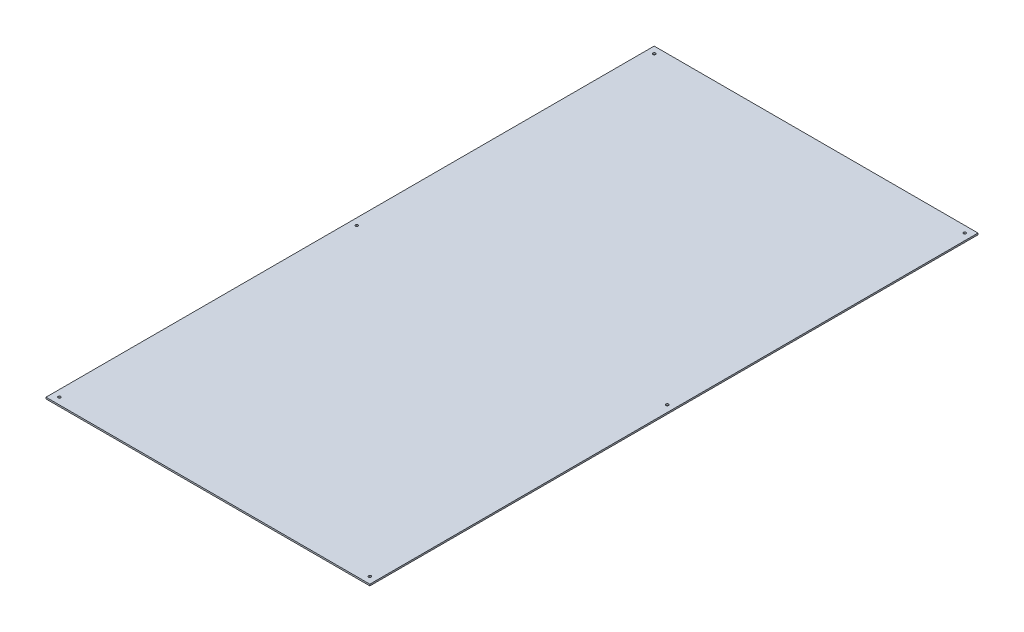
ISO-10303-21;
HEADER;
FILE_DESCRIPTION(('STEP AP214'),'2;1');
FILE_NAME('part.step','',(''),(''),'','','');
FILE_SCHEMA(('AUTOMOTIVE_DESIGN { 1 0 10303 214 1 1 1 1 }'));
ENDSEC;
DATA;
#1=APPLICATION_CONTEXT('core data for automotive mechanical design processes');
#2=APPLICATION_PROTOCOL_DEFINITION('international standard','automotive_design',2000,#1);
#3=PRODUCT_CONTEXT('',#1,'mechanical');
#4=PRODUCT('Part','Part','',(#3));
#5=PRODUCT_RELATED_PRODUCT_CATEGORY('part','',(#4));
#6=PRODUCT_DEFINITION_FORMATION('','',#4);
#7=PRODUCT_DEFINITION_CONTEXT('part definition',#1,'design');
#8=PRODUCT_DEFINITION('design','',#6,#7);
#9=PRODUCT_DEFINITION_SHAPE('','',#8);
#10=(LENGTH_UNIT() NAMED_UNIT(*) SI_UNIT(.MILLI.,.METRE.));
#11=(NAMED_UNIT(*) PLANE_ANGLE_UNIT() SI_UNIT($,.RADIAN.));
#12=(NAMED_UNIT(*) SI_UNIT($,.STERADIAN.) SOLID_ANGLE_UNIT());
#13=UNCERTAINTY_MEASURE_WITH_UNIT(LENGTH_MEASURE(1.E-05),#10,'distance_accuracy_value','');
#14=(GEOMETRIC_REPRESENTATION_CONTEXT(3) GLOBAL_UNCERTAINTY_ASSIGNED_CONTEXT((#13)) GLOBAL_UNIT_ASSIGNED_CONTEXT((#10,
#11,#12)) REPRESENTATION_CONTEXT('',''));
#15=CARTESIAN_POINT('',(0.,0.,0.));
#16=DIRECTION('',(0.,0.,1.));
#17=DIRECTION('',(1.,0.,0.));
#18=AXIS2_PLACEMENT_3D('',#15,#16,#17);
#19=CARTESIAN_POINT('',(0.,2.8,0.));
#20=DIRECTION('',(0.,-1.,0.));
#21=DIRECTION('',(0.,0.,-1.));
#22=AXIS2_PLACEMENT_3D('',#19,#20,#21);
#23=PLANE('',#22);
#24=DIRECTION('',(0.,0.,1.));
#25=VECTOR('',#24,1.);
#26=CARTESIAN_POINT('',(-291.,2.8,-546.5));
#27=LINE('',#26,#25);
#28=CARTESIAN_POINT('',(-291.,2.8,-546.5));
#29=VERTEX_POINT('',#28);
#30=CARTESIAN_POINT('',(-291.,2.8,546.5));
#31=VERTEX_POINT('',#30);
#32=EDGE_CURVE('E89',#29,#31,#27,.T.);
#33=ORIENTED_EDGE('',*,*,#32,.T.);
#34=DIRECTION('',(1.,0.,0.));
#35=VECTOR('',#34,1.);
#36=CARTESIAN_POINT('',(291.,2.8,546.5));
#37=LINE('',#36,#35);
#38=CARTESIAN_POINT('',(291.,2.8,546.5));
#39=VERTEX_POINT('',#38);
#40=EDGE_CURVE('E84',#31,#39,#37,.T.);
#41=ORIENTED_EDGE('',*,*,#40,.T.);
#42=DIRECTION('',(0.,0.,-1.));
#43=VECTOR('',#42,1.);
#44=CARTESIAN_POINT('',(291.,2.8,-546.5));
#45=LINE('',#44,#43);
#46=CARTESIAN_POINT('',(291.,2.8,-546.5));
#47=VERTEX_POINT('',#46);
#48=EDGE_CURVE('E87',#39,#47,#45,.T.);
#49=ORIENTED_EDGE('',*,*,#48,.T.);
#50=DIRECTION('',(-1.,0.,0.));
#51=VECTOR('',#50,1.);
#52=CARTESIAN_POINT('',(291.,2.8,-546.5));
#53=LINE('',#52,#51);
#54=EDGE_CURVE('E54',#47,#29,#53,.T.);
#55=ORIENTED_EDGE('',*,*,#54,.T.);
#56=EDGE_LOOP('',(#33,#41,#49,#55));
#57=FACE_BOUND('',#56,.T.);
#58=CARTESIAN_POINT('',(279.,2.8,-534.5));
#59=DIRECTION('',(0.,1.,0.));
#60=DIRECTION('',(0.,0.,1.));
#61=AXIS2_PLACEMENT_3D('',#58,#59,#60);
#62=CIRCLE('',#61,2.38125000000001);
#63=CARTESIAN_POINT('',(279.,2.8,-532.11875));
#64=VERTEX_POINT('',#63);
#65=EDGE_CURVE('E104',#64,#64,#62,.T.);
#66=ORIENTED_EDGE('',*,*,#65,.F.);
#67=EDGE_LOOP('',(#66));
#68=FACE_BOUND('',#67,.T.);
#69=CARTESIAN_POINT('',(-279.,2.8,-534.5));
#70=DIRECTION('',(0.,1.,0.));
#71=DIRECTION('',(0.,0.,1.));
#72=AXIS2_PLACEMENT_3D('',#69,#70,#71);
#73=CIRCLE('',#72,2.38125000000001);
#74=CARTESIAN_POINT('',(-279.,2.8,-532.11875));
#75=VERTEX_POINT('',#74);
#76=EDGE_CURVE('E119',#75,#75,#73,.T.);
#77=ORIENTED_EDGE('',*,*,#76,.F.);
#78=EDGE_LOOP('',(#77));
#79=FACE_BOUND('',#78,.T.);
#80=CARTESIAN_POINT('',(-279.,2.8,-2.22044604925031E-13));
#81=DIRECTION('',(0.,1.,0.));
#82=DIRECTION('',(0.,0.,1.));
#83=AXIS2_PLACEMENT_3D('',#80,#81,#82);
#84=CIRCLE('',#83,2.38125000000001);
#85=CARTESIAN_POINT('',(-279.,2.8,2.38124999999978));
#86=VERTEX_POINT('',#85);
#87=EDGE_CURVE('E125',#86,#86,#84,.T.);
#88=ORIENTED_EDGE('',*,*,#87,.F.);
#89=EDGE_LOOP('',(#88));
#90=FACE_BOUND('',#89,.T.);
#91=CARTESIAN_POINT('',(279.,2.8,-2.22044604925031E-13));
#92=DIRECTION('',(0.,1.,0.));
#93=DIRECTION('',(0.,0.,1.));
#94=AXIS2_PLACEMENT_3D('',#91,#92,#93);
#95=CIRCLE('',#94,2.38125000000001);
#96=CARTESIAN_POINT('',(279.,2.8,2.38124999999978));
#97=VERTEX_POINT('',#96);
#98=EDGE_CURVE('E131',#97,#97,#95,.T.);
#99=ORIENTED_EDGE('',*,*,#98,.F.);
#100=EDGE_LOOP('',(#99));
#101=FACE_BOUND('',#100,.T.);
#102=CARTESIAN_POINT('',(-279.,2.8,534.5));
#103=DIRECTION('',(0.,1.,0.));
#104=DIRECTION('',(0.,0.,1.));
#105=AXIS2_PLACEMENT_3D('',#102,#103,#104);
#106=CIRCLE('',#105,2.38125000000001);
#107=CARTESIAN_POINT('',(-279.,2.8,536.88125));
#108=VERTEX_POINT('',#107);
#109=EDGE_CURVE('E137',#108,#108,#106,.T.);
#110=ORIENTED_EDGE('',*,*,#109,.F.);
#111=EDGE_LOOP('',(#110));
#112=FACE_BOUND('',#111,.T.);
#113=CARTESIAN_POINT('',(279.,2.8,534.5));
#114=DIRECTION('',(0.,1.,0.));
#115=DIRECTION('',(0.,0.,1.));
#116=AXIS2_PLACEMENT_3D('',#113,#114,#115);
#117=CIRCLE('',#116,2.38125000000001);
#118=CARTESIAN_POINT('',(279.,2.8,536.88125));
#119=VERTEX_POINT('',#118);
#120=EDGE_CURVE('E143',#119,#119,#117,.T.);
#121=ORIENTED_EDGE('',*,*,#120,.F.);
#122=EDGE_LOOP('',(#121));
#123=FACE_BOUND('',#122,.T.);
#124=ADVANCED_FACE('F37',(#57,#68,#79,#90,#101,#112,#123),#23,.F.);
#125=CARTESIAN_POINT('',(0.,0.,0.));
#126=DIRECTION('',(0.,-1.,0.));
#127=DIRECTION('',(0.,0.,-1.));
#128=AXIS2_PLACEMENT_3D('',#125,#126,#127);
#129=PLANE('',#128);
#130=CARTESIAN_POINT('',(-279.,0.,534.5));
#131=DIRECTION('',(0.,1.,0.));
#132=DIRECTION('',(0.,0.,1.));
#133=AXIS2_PLACEMENT_3D('',#130,#131,#132);
#134=CIRCLE('',#133,2.38125000000001);
#135=CARTESIAN_POINT('',(-279.,0.,536.88125));
#136=VERTEX_POINT('',#135);
#137=EDGE_CURVE('E140',#136,#136,#134,.T.);
#138=ORIENTED_EDGE('',*,*,#137,.T.);
#139=EDGE_LOOP('',(#138));
#140=FACE_BOUND('',#139,.T.);
#141=CARTESIAN_POINT('',(-279.,0.,-2.22044604925031E-13));
#142=DIRECTION('',(0.,1.,0.));
#143=DIRECTION('',(0.,0.,1.));
#144=AXIS2_PLACEMENT_3D('',#141,#142,#143);
#145=CIRCLE('',#144,2.38125000000001);
#146=CARTESIAN_POINT('',(-279.,0.,2.38124999999978));
#147=VERTEX_POINT('',#146);
#148=EDGE_CURVE('E128',#147,#147,#145,.T.);
#149=ORIENTED_EDGE('',*,*,#148,.T.);
#150=EDGE_LOOP('',(#149));
#151=FACE_BOUND('',#150,.T.);
#152=CARTESIAN_POINT('',(279.,0.,-534.5));
#153=DIRECTION('',(0.,1.,0.));
#154=DIRECTION('',(0.,0.,1.));
#155=AXIS2_PLACEMENT_3D('',#152,#153,#154);
#156=CIRCLE('',#155,2.38125000000001);
#157=CARTESIAN_POINT('',(279.,0.,-532.11875));
#158=VERTEX_POINT('',#157);
#159=EDGE_CURVE('E116',#158,#158,#156,.T.);
#160=ORIENTED_EDGE('',*,*,#159,.T.);
#161=EDGE_LOOP('',(#160));
#162=FACE_BOUND('',#161,.T.);
#163=DIRECTION('',(0.,0.,1.));
#164=VECTOR('',#163,1.);
#165=CARTESIAN_POINT('',(-291.,0.,-546.5));
#166=LINE('',#165,#164);
#167=CARTESIAN_POINT('',(-291.,0.,-546.5));
#168=VERTEX_POINT('',#167);
#169=CARTESIAN_POINT('',(-291.,0.,546.5));
#170=VERTEX_POINT('',#169);
#171=EDGE_CURVE('E101',#168,#170,#166,.T.);
#172=ORIENTED_EDGE('',*,*,#171,.F.);
#173=DIRECTION('',(-1.,0.,0.));
#174=VECTOR('',#173,1.);
#175=CARTESIAN_POINT('',(291.,0.,-546.5));
#176=LINE('',#175,#174);
#177=CARTESIAN_POINT('',(291.,0.,-546.5));
#178=VERTEX_POINT('',#177);
#179=EDGE_CURVE('E77',#178,#168,#176,.T.);
#180=ORIENTED_EDGE('',*,*,#179,.F.);
#181=DIRECTION('',(0.,0.,-1.));
#182=VECTOR('',#181,1.);
#183=CARTESIAN_POINT('',(291.,0.,-546.5));
#184=LINE('',#183,#182);
#185=CARTESIAN_POINT('',(291.,0.,546.5));
#186=VERTEX_POINT('',#185);
#187=EDGE_CURVE('E71',#186,#178,#184,.T.);
#188=ORIENTED_EDGE('',*,*,#187,.F.);
#189=DIRECTION('',(1.,0.,0.));
#190=VECTOR('',#189,1.);
#191=CARTESIAN_POINT('',(291.,0.,546.5));
#192=LINE('',#191,#190);
#193=EDGE_CURVE('E93',#170,#186,#192,.T.);
#194=ORIENTED_EDGE('',*,*,#193,.F.);
#195=EDGE_LOOP('',(#172,#180,#188,#194));
#196=FACE_BOUND('',#195,.T.);
#197=CARTESIAN_POINT('',(-279.,0.,-534.5));
#198=DIRECTION('',(0.,1.,0.));
#199=DIRECTION('',(0.,0.,1.));
#200=AXIS2_PLACEMENT_3D('',#197,#198,#199);
#201=CIRCLE('',#200,2.38125000000001);
#202=CARTESIAN_POINT('',(-279.,0.,-532.11875));
#203=VERTEX_POINT('',#202);
#204=EDGE_CURVE('E122',#203,#203,#201,.T.);
#205=ORIENTED_EDGE('',*,*,#204,.T.);
#206=EDGE_LOOP('',(#205));
#207=FACE_BOUND('',#206,.T.);
#208=CARTESIAN_POINT('',(279.,0.,-2.22044604925031E-13));
#209=DIRECTION('',(0.,1.,0.));
#210=DIRECTION('',(0.,0.,1.));
#211=AXIS2_PLACEMENT_3D('',#208,#209,#210);
#212=CIRCLE('',#211,2.38125000000001);
#213=CARTESIAN_POINT('',(279.,0.,2.38124999999978));
#214=VERTEX_POINT('',#213);
#215=EDGE_CURVE('E134',#214,#214,#212,.T.);
#216=ORIENTED_EDGE('',*,*,#215,.T.);
#217=EDGE_LOOP('',(#216));
#218=FACE_BOUND('',#217,.T.);
#219=CARTESIAN_POINT('',(279.,0.,534.5));
#220=DIRECTION('',(0.,1.,0.));
#221=DIRECTION('',(0.,0.,1.));
#222=AXIS2_PLACEMENT_3D('',#219,#220,#221);
#223=CIRCLE('',#222,2.38125000000001);
#224=CARTESIAN_POINT('',(279.,0.,536.88125));
#225=VERTEX_POINT('',#224);
#226=EDGE_CURVE('E146',#225,#225,#223,.T.);
#227=ORIENTED_EDGE('',*,*,#226,.T.);
#228=EDGE_LOOP('',(#227));
#229=FACE_BOUND('',#228,.T.);
#230=ADVANCED_FACE('F112',(#140,#151,#162,#196,#207,#218,#229),#129,.T.);
#231=CARTESIAN_POINT('',(-291.,2.8,-546.5));
#232=DIRECTION('',(1.,0.,0.));
#233=DIRECTION('',(0.,0.,-1.));
#234=AXIS2_PLACEMENT_3D('',#231,#232,#233);
#235=PLANE('',#234);
#236=ORIENTED_EDGE('',*,*,#171,.T.);
#237=DIRECTION('',(0.,-1.,0.));
#238=VECTOR('',#237,1.);
#239=CARTESIAN_POINT('',(-291.,2.8,546.5));
#240=LINE('',#239,#238);
#241=EDGE_CURVE('E11',#31,#170,#240,.T.);
#242=ORIENTED_EDGE('',*,*,#241,.F.);
#243=ORIENTED_EDGE('',*,*,#32,.F.);
#244=DIRECTION('',(0.,-1.,0.));
#245=VECTOR('',#244,1.);
#246=CARTESIAN_POINT('',(-291.,2.8,-546.5));
#247=LINE('',#246,#245);
#248=EDGE_CURVE('E97',#29,#168,#247,.T.);
#249=ORIENTED_EDGE('',*,*,#248,.T.);
#250=EDGE_LOOP('',(#236,#242,#243,#249));
#251=FACE_BOUND('',#250,.T.);
#252=ADVANCED_FACE('F39',(#251),#235,.F.);
#253=CARTESIAN_POINT('',(291.,2.8,546.5));
#254=DIRECTION('',(0.,0.,-1.));
#255=DIRECTION('',(-1.,0.,0.));
#256=AXIS2_PLACEMENT_3D('',#253,#254,#255);
#257=PLANE('',#256);
#258=ORIENTED_EDGE('',*,*,#193,.T.);
#259=DIRECTION('',(0.,-1.,0.));
#260=VECTOR('',#259,1.);
#261=CARTESIAN_POINT('',(291.,2.8,546.5));
#262=LINE('',#261,#260);
#263=EDGE_CURVE('E46',#39,#186,#262,.T.);
#264=ORIENTED_EDGE('',*,*,#263,.F.);
#265=ORIENTED_EDGE('',*,*,#40,.F.);
#266=ORIENTED_EDGE('',*,*,#241,.T.);
#267=EDGE_LOOP('',(#258,#264,#265,#266));
#268=FACE_BOUND('',#267,.T.);
#269=ADVANCED_FACE('F92',(#268),#257,.F.);
#270=CARTESIAN_POINT('',(291.,2.8,-546.5));
#271=DIRECTION('',(-1.,0.,0.));
#272=DIRECTION('',(0.,0.,1.));
#273=AXIS2_PLACEMENT_3D('',#270,#271,#272);
#274=PLANE('',#273);
#275=ORIENTED_EDGE('',*,*,#187,.T.);
#276=DIRECTION('',(0.,-1.,0.));
#277=VECTOR('',#276,1.);
#278=CARTESIAN_POINT('',(291.,2.8,-546.5));
#279=LINE('',#278,#277);
#280=EDGE_CURVE('E94',#47,#178,#279,.T.);
#281=ORIENTED_EDGE('',*,*,#280,.F.);
#282=ORIENTED_EDGE('',*,*,#48,.F.);
#283=ORIENTED_EDGE('',*,*,#263,.T.);
#284=EDGE_LOOP('',(#275,#281,#282,#283));
#285=FACE_BOUND('',#284,.T.);
#286=ADVANCED_FACE('F95',(#285),#274,.F.);
#287=CARTESIAN_POINT('',(291.,2.8,-546.5));
#288=DIRECTION('',(0.,0.,1.));
#289=DIRECTION('',(1.,0.,0.));
#290=AXIS2_PLACEMENT_3D('',#287,#288,#289);
#291=PLANE('',#290);
#292=ORIENTED_EDGE('',*,*,#179,.T.);
#293=ORIENTED_EDGE('',*,*,#248,.F.);
#294=ORIENTED_EDGE('',*,*,#54,.F.);
#295=ORIENTED_EDGE('',*,*,#280,.T.);
#296=EDGE_LOOP('',(#292,#293,#294,#295));
#297=FACE_BOUND('',#296,.T.);
#298=ADVANCED_FACE('F109',(#297),#291,.F.);
#299=CARTESIAN_POINT('',(279.,2.8,-534.5));
#300=DIRECTION('',(0.,-1.,0.));
#301=DIRECTION('',(0.,0.,-1.));
#302=AXIS2_PLACEMENT_3D('',#299,#300,#301);
#303=CYLINDRICAL_SURFACE('',#302,2.38125000000001);
#304=ORIENTED_EDGE('',*,*,#65,.T.);
#305=EDGE_LOOP('',(#304));
#306=FACE_BOUND('',#305,.T.);
#307=ORIENTED_EDGE('',*,*,#159,.F.);
#308=EDGE_LOOP('',(#307));
#309=FACE_BOUND('',#308,.T.);
#310=ADVANCED_FACE('F163',(#306,#309),#303,.F.);
#311=CARTESIAN_POINT('',(-279.,2.8,-534.5));
#312=DIRECTION('',(0.,-1.,0.));
#313=DIRECTION('',(0.,0.,-1.));
#314=AXIS2_PLACEMENT_3D('',#311,#312,#313);
#315=CYLINDRICAL_SURFACE('',#314,2.38125000000001);
#316=ORIENTED_EDGE('',*,*,#76,.T.);
#317=EDGE_LOOP('',(#316));
#318=FACE_BOUND('',#317,.T.);
#319=ORIENTED_EDGE('',*,*,#204,.F.);
#320=EDGE_LOOP('',(#319));
#321=FACE_BOUND('',#320,.T.);
#322=ADVANCED_FACE('F217',(#318,#321),#315,.F.);
#323=CARTESIAN_POINT('',(-279.,2.8,-2.22044604925031E-13));
#324=DIRECTION('',(0.,-1.,0.));
#325=DIRECTION('',(0.,0.,-1.));
#326=AXIS2_PLACEMENT_3D('',#323,#324,#325);
#327=CYLINDRICAL_SURFACE('',#326,2.38125000000001);
#328=ORIENTED_EDGE('',*,*,#87,.T.);
#329=EDGE_LOOP('',(#328));
#330=FACE_BOUND('',#329,.T.);
#331=ORIENTED_EDGE('',*,*,#148,.F.);
#332=EDGE_LOOP('',(#331));
#333=FACE_BOUND('',#332,.T.);
#334=ADVANCED_FACE('F226',(#330,#333),#327,.F.);
#335=CARTESIAN_POINT('',(279.,2.8,-2.22044604925031E-13));
#336=DIRECTION('',(0.,-1.,0.));
#337=DIRECTION('',(0.,0.,-1.));
#338=AXIS2_PLACEMENT_3D('',#335,#336,#337);
#339=CYLINDRICAL_SURFACE('',#338,2.38125000000001);
#340=ORIENTED_EDGE('',*,*,#98,.T.);
#341=EDGE_LOOP('',(#340));
#342=FACE_BOUND('',#341,.T.);
#343=ORIENTED_EDGE('',*,*,#215,.F.);
#344=EDGE_LOOP('',(#343));
#345=FACE_BOUND('',#344,.T.);
#346=ADVANCED_FACE('F235',(#342,#345),#339,.F.);
#347=CARTESIAN_POINT('',(-279.,2.8,534.5));
#348=DIRECTION('',(0.,-1.,0.));
#349=DIRECTION('',(0.,0.,-1.));
#350=AXIS2_PLACEMENT_3D('',#347,#348,#349);
#351=CYLINDRICAL_SURFACE('',#350,2.38125000000001);
#352=ORIENTED_EDGE('',*,*,#109,.T.);
#353=EDGE_LOOP('',(#352));
#354=FACE_BOUND('',#353,.T.);
#355=ORIENTED_EDGE('',*,*,#137,.F.);
#356=EDGE_LOOP('',(#355));
#357=FACE_BOUND('',#356,.T.);
#358=ADVANCED_FACE('F245',(#354,#357),#351,.F.);
#359=CARTESIAN_POINT('',(279.,2.8,534.5));
#360=DIRECTION('',(0.,-1.,0.));
#361=DIRECTION('',(0.,0.,-1.));
#362=AXIS2_PLACEMENT_3D('',#359,#360,#361);
#363=CYLINDRICAL_SURFACE('',#362,2.38125000000001);
#364=ORIENTED_EDGE('',*,*,#120,.T.);
#365=EDGE_LOOP('',(#364));
#366=FACE_BOUND('',#365,.T.);
#367=ORIENTED_EDGE('',*,*,#226,.F.);
#368=EDGE_LOOP('',(#367));
#369=FACE_BOUND('',#368,.T.);
#370=ADVANCED_FACE('F152',(#366,#369),#363,.F.);
#371=CLOSED_SHELL('',(#124,#230,#252,#269,#286,#298,#310,#322,#334,#346,#358,#370));
#372=MANIFOLD_SOLID_BREP('B2',#371);
#373=ADVANCED_BREP_SHAPE_REPRESENTATION('',(#18,#372),#14);
#374=SHAPE_DEFINITION_REPRESENTATION(#9,#373);
ENDSEC;
END-ISO-10303-21;
